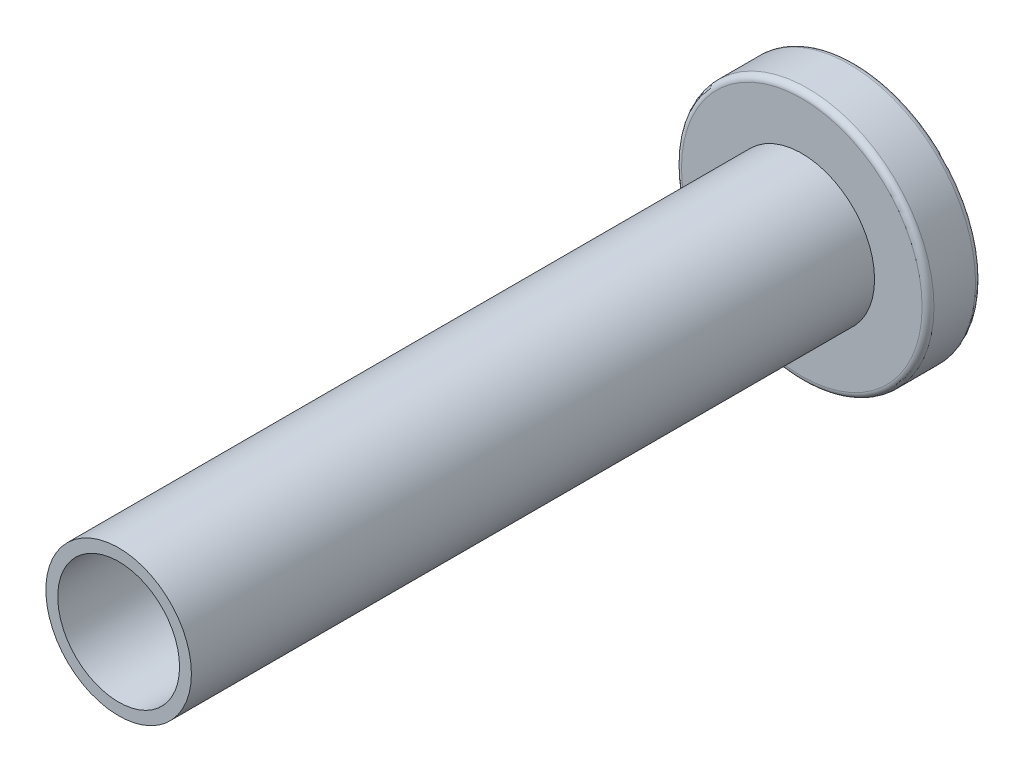
ISO-10303-21;
HEADER;
FILE_DESCRIPTION(('STEP AP214'),'2;1');
FILE_NAME('part.step','',(''),(''),'','','');
FILE_SCHEMA(('AUTOMOTIVE_DESIGN { 1 0 10303 214 1 1 1 1 }'));
ENDSEC;
DATA;
#1=APPLICATION_CONTEXT('core data for automotive mechanical design processes');
#2=APPLICATION_PROTOCOL_DEFINITION('international standard','automotive_design',2000,#1);
#3=PRODUCT_CONTEXT('',#1,'mechanical');
#4=PRODUCT('Part','Part','',(#3));
#5=PRODUCT_RELATED_PRODUCT_CATEGORY('part','',(#4));
#6=PRODUCT_DEFINITION_FORMATION('','',#4);
#7=PRODUCT_DEFINITION_CONTEXT('part definition',#1,'design');
#8=PRODUCT_DEFINITION('design','',#6,#7);
#9=PRODUCT_DEFINITION_SHAPE('','',#8);
#10=(LENGTH_UNIT() NAMED_UNIT(*) SI_UNIT(.MILLI.,.METRE.));
#11=(NAMED_UNIT(*) PLANE_ANGLE_UNIT() SI_UNIT($,.RADIAN.));
#12=(NAMED_UNIT(*) SI_UNIT($,.STERADIAN.) SOLID_ANGLE_UNIT());
#13=UNCERTAINTY_MEASURE_WITH_UNIT(LENGTH_MEASURE(1.E-05),#10,'distance_accuracy_value','');
#14=(GEOMETRIC_REPRESENTATION_CONTEXT(3) GLOBAL_UNCERTAINTY_ASSIGNED_CONTEXT((#13)) GLOBAL_UNIT_ASSIGNED_CONTEXT((#10,
#11,#12)) REPRESENTATION_CONTEXT('',''));
#15=CARTESIAN_POINT('',(0.,0.,0.));
#16=DIRECTION('',(0.,0.,1.));
#17=DIRECTION('',(1.,0.,0.));
#18=AXIS2_PLACEMENT_3D('',#15,#16,#17);
#19=CARTESIAN_POINT('',(0.,0.,1.8));
#20=DIRECTION('',(0.,0.,-1.));
#21=DIRECTION('',(-1.,0.,0.));
#22=AXIS2_PLACEMENT_3D('',#19,#20,#21);
#23=CYLINDRICAL_SURFACE('',#22,4.25);
#24=CARTESIAN_POINT('',(0.,0.,0.2));
#25=DIRECTION('',(0.,0.,1.));
#26=DIRECTION('',(1.,0.,0.));
#27=AXIS2_PLACEMENT_3D('',#24,#25,#26);
#28=CIRCLE('',#27,4.25);
#29=CARTESIAN_POINT('',(4.25,0.,0.2));
#30=VERTEX_POINT('',#29);
#31=EDGE_CURVE('E160',#30,#30,#28,.T.);
#32=ORIENTED_EDGE('',*,*,#31,.T.);
#33=EDGE_LOOP('',(#32));
#34=FACE_BOUND('',#33,.T.);
#35=CARTESIAN_POINT('',(0.,0.,1.6));
#36=DIRECTION('',(0.,0.,1.));
#37=DIRECTION('',(1.,0.,0.));
#38=AXIS2_PLACEMENT_3D('',#35,#36,#37);
#39=CIRCLE('',#38,4.25);
#40=CARTESIAN_POINT('',(4.25,0.,1.6));
#41=VERTEX_POINT('',#40);
#42=EDGE_CURVE('E157',#41,#41,#39,.F.);
#43=ORIENTED_EDGE('',*,*,#42,.T.);
#44=EDGE_LOOP('',(#43));
#45=FACE_BOUND('',#44,.T.);
#46=ADVANCED_FACE('F38',(#34,#45),#23,.T.);
#47=CARTESIAN_POINT('',(0.,0.,1.8));
#48=DIRECTION('',(0.,0.,1.));
#49=DIRECTION('',(1.,0.,0.));
#50=AXIS2_PLACEMENT_3D('',#47,#48,#49);
#51=PLANE('',#50);
#52=CARTESIAN_POINT('',(0.,0.,1.8));
#53=DIRECTION('',(0.,0.,1.));
#54=DIRECTION('',(1.,0.,0.));
#55=AXIS2_PLACEMENT_3D('',#52,#53,#54);
#56=CIRCLE('',#55,4.05);
#57=CARTESIAN_POINT('',(4.05,0.,1.8));
#58=VERTEX_POINT('',#57);
#59=EDGE_CURVE('E11',#58,#58,#56,.T.);
#60=ORIENTED_EDGE('',*,*,#59,.T.);
#61=EDGE_LOOP('',(#60));
#62=FACE_BOUND('',#61,.T.);
#63=CARTESIAN_POINT('',(0.,0.,1.8));
#64=DIRECTION('',(0.,0.,1.));
#65=DIRECTION('',(1.,0.,0.));
#66=AXIS2_PLACEMENT_3D('',#63,#64,#65);
#67=CIRCLE('',#66,2.45);
#68=CARTESIAN_POINT('',(2.45,0.,1.8));
#69=VERTEX_POINT('',#68);
#70=EDGE_CURVE('E148',#69,#69,#67,.T.);
#71=ORIENTED_EDGE('',*,*,#70,.F.);
#72=EDGE_LOOP('',(#71));
#73=FACE_BOUND('',#72,.T.);
#74=ADVANCED_FACE('F175',(#62,#73),#51,.T.);
#75=CARTESIAN_POINT('',(0.,0.,0.));
#76=DIRECTION('',(0.,0.,1.));
#77=DIRECTION('',(1.,0.,0.));
#78=AXIS2_PLACEMENT_3D('',#75,#76,#77);
#79=PLANE('',#78);
#80=DIRECTION('',(0.5,0.866025403784438,0.));
#81=VECTOR('',#80,1.);
#82=CARTESIAN_POINT('',(-1.44337567297407,0.,0.));
#83=LINE('',#82,#81);
#84=CARTESIAN_POINT('',(-1.44337567297407,0.,0.));
#85=VERTEX_POINT('',#84);
#86=CARTESIAN_POINT('',(-0.721687836487032,1.25,0.));
#87=VERTEX_POINT('',#86);
#88=EDGE_CURVE('E127',#85,#87,#83,.T.);
#89=ORIENTED_EDGE('',*,*,#88,.F.);
#90=DIRECTION('',(-0.5,0.866025403784438,0.));
#91=VECTOR('',#90,1.);
#92=CARTESIAN_POINT('',(-0.721687836487033,-1.25,0.));
#93=LINE('',#92,#91);
#94=CARTESIAN_POINT('',(-0.721687836487033,-1.25,0.));
#95=VERTEX_POINT('',#94);
#96=EDGE_CURVE('E53',#95,#85,#93,.T.);
#97=ORIENTED_EDGE('',*,*,#96,.F.);
#98=DIRECTION('',(-1.,0.,0.));
#99=VECTOR('',#98,1.);
#100=CARTESIAN_POINT('',(0.721687836487032,-1.25,0.));
#101=LINE('',#100,#99);
#102=CARTESIAN_POINT('',(0.721687836487032,-1.25,0.));
#103=VERTEX_POINT('',#102);
#104=EDGE_CURVE('E136',#103,#95,#101,.T.);
#105=ORIENTED_EDGE('',*,*,#104,.F.);
#106=DIRECTION('',(-0.5,-0.866025403784438,0.));
#107=VECTOR('',#106,1.);
#108=CARTESIAN_POINT('',(1.44337567297406,0.,0.));
#109=LINE('',#108,#107);
#110=CARTESIAN_POINT('',(1.44337567297406,0.,0.));
#111=VERTEX_POINT('',#110);
#112=EDGE_CURVE('E134',#111,#103,#109,.T.);
#113=ORIENTED_EDGE('',*,*,#112,.F.);
#114=DIRECTION('',(0.5,-0.866025403784438,0.));
#115=VECTOR('',#114,1.);
#116=CARTESIAN_POINT('',(0.721687836487032,1.25,0.));
#117=LINE('',#116,#115);
#118=CARTESIAN_POINT('',(0.721687836487032,1.25,0.));
#119=VERTEX_POINT('',#118);
#120=EDGE_CURVE('E101',#119,#111,#117,.T.);
#121=ORIENTED_EDGE('',*,*,#120,.F.);
#122=DIRECTION('',(1.,0.,0.));
#123=VECTOR('',#122,1.);
#124=CARTESIAN_POINT('',(-0.721687836487032,1.25,0.));
#125=LINE('',#124,#123);
#126=EDGE_CURVE('E130',#87,#119,#125,.T.);
#127=ORIENTED_EDGE('',*,*,#126,.F.);
#128=EDGE_LOOP('',(#89,#97,#105,#113,#121,#127));
#129=FACE_BOUND('',#128,.T.);
#130=CARTESIAN_POINT('',(0.,0.,0.));
#131=DIRECTION('',(0.,0.,1.));
#132=DIRECTION('',(1.,0.,0.));
#133=AXIS2_PLACEMENT_3D('',#130,#131,#132);
#134=CIRCLE('',#133,4.05);
#135=CARTESIAN_POINT('',(4.05,0.,0.));
#136=VERTEX_POINT('',#135);
#137=EDGE_CURVE('E46',#136,#136,#134,.F.);
#138=ORIENTED_EDGE('',*,*,#137,.T.);
#139=EDGE_LOOP('',(#138));
#140=FACE_BOUND('',#139,.T.);
#141=ADVANCED_FACE('F165',(#129,#140),#79,.F.);
#142=CARTESIAN_POINT('',(0.,0.,24.8));
#143=DIRECTION('',(0.,0.,1.));
#144=DIRECTION('',(1.,0.,0.));
#145=AXIS2_PLACEMENT_3D('',#142,#143,#144);
#146=PLANE('',#145);
#147=CARTESIAN_POINT('',(0.,0.,24.8));
#148=DIRECTION('',(0.,0.,1.));
#149=DIRECTION('',(1.,0.,0.));
#150=AXIS2_PLACEMENT_3D('',#147,#148,#149);
#151=CIRCLE('',#150,2.45);
#152=CARTESIAN_POINT('',(2.45,0.,24.8));
#153=VERTEX_POINT('',#152);
#154=EDGE_CURVE('E149',#153,#153,#151,.T.);
#155=ORIENTED_EDGE('',*,*,#154,.T.);
#156=EDGE_LOOP('',(#155));
#157=FACE_BOUND('',#156,.T.);
#158=CARTESIAN_POINT('',(0.,0.,24.8));
#159=DIRECTION('',(0.,0.,1.));
#160=DIRECTION('',(1.,0.,0.));
#161=AXIS2_PLACEMENT_3D('',#158,#159,#160);
#162=CIRCLE('',#161,2.05);
#163=CARTESIAN_POINT('',(2.05,0.,24.8));
#164=VERTEX_POINT('',#163);
#165=EDGE_CURVE('E140',#164,#164,#162,.T.);
#166=ORIENTED_EDGE('',*,*,#165,.F.);
#167=EDGE_LOOP('',(#166));
#168=FACE_BOUND('',#167,.T.);
#169=ADVANCED_FACE('F192',(#157,#168),#146,.T.);
#170=CARTESIAN_POINT('',(0.,0.,24.8));
#171=DIRECTION('',(0.,0.,-1.));
#172=DIRECTION('',(-1.,0.,0.));
#173=AXIS2_PLACEMENT_3D('',#170,#171,#172);
#174=CYLINDRICAL_SURFACE('',#173,2.45);
#175=ORIENTED_EDGE('',*,*,#154,.F.);
#176=EDGE_LOOP('',(#175));
#177=FACE_BOUND('',#176,.T.);
#178=ORIENTED_EDGE('',*,*,#70,.T.);
#179=EDGE_LOOP('',(#178));
#180=FACE_BOUND('',#179,.T.);
#181=ADVANCED_FACE('F189',(#177,#180),#174,.T.);
#182=CARTESIAN_POINT('',(0.,0.,24.8));
#183=DIRECTION('',(0.,0.,-1.));
#184=DIRECTION('',(-1.,0.,0.));
#185=AXIS2_PLACEMENT_3D('',#182,#183,#184);
#186=CYLINDRICAL_SURFACE('',#185,2.05);
#187=ORIENTED_EDGE('',*,*,#165,.T.);
#188=EDGE_LOOP('',(#187));
#189=FACE_BOUND('',#188,.T.);
#190=CARTESIAN_POINT('',(0.,0.,1.8));
#191=DIRECTION('',(0.,0.,1.));
#192=DIRECTION('',(1.,0.,0.));
#193=AXIS2_PLACEMENT_3D('',#190,#191,#192);
#194=CIRCLE('',#193,2.05);
#195=CARTESIAN_POINT('',(2.05,0.,1.8));
#196=VERTEX_POINT('',#195);
#197=EDGE_CURVE('E152',#196,#196,#194,.F.);
#198=ORIENTED_EDGE('',*,*,#197,.T.);
#199=EDGE_LOOP('',(#198));
#200=FACE_BOUND('',#199,.T.);
#201=ADVANCED_FACE('F191',(#189,#200),#186,.F.);
#202=ORIENTED_EDGE('',*,*,#197,.F.);
#203=EDGE_LOOP('',(#202));
#204=FACE_BOUND('',#203,.T.);
#205=ADVANCED_FACE('F170',(#204),#51,.T.);
#206=CARTESIAN_POINT('',(0.,0.,0.2));
#207=DIRECTION('',(0.,0.,1.));
#208=DIRECTION('',(1.,0.,0.));
#209=AXIS2_PLACEMENT_3D('',#206,#207,#208);
#210=TOROIDAL_SURFACE('',#209,4.05,0.2);
#211=ORIENTED_EDGE('',*,*,#137,.F.);
#212=EDGE_LOOP('',(#211));
#213=FACE_BOUND('',#212,.T.);
#214=ORIENTED_EDGE('',*,*,#31,.F.);
#215=EDGE_LOOP('',(#214));
#216=FACE_BOUND('',#215,.T.);
#217=ADVANCED_FACE('F167',(#213,#216),#210,.T.);
#218=CARTESIAN_POINT('',(0.,0.,1.6));
#219=DIRECTION('',(0.,0.,1.));
#220=DIRECTION('',(1.,0.,0.));
#221=AXIS2_PLACEMENT_3D('',#218,#219,#220);
#222=TOROIDAL_SURFACE('',#221,4.05,0.2);
#223=ORIENTED_EDGE('',*,*,#42,.F.);
#224=EDGE_LOOP('',(#223));
#225=FACE_BOUND('',#224,.T.);
#226=ORIENTED_EDGE('',*,*,#59,.F.);
#227=EDGE_LOOP('',(#226));
#228=FACE_BOUND('',#227,.T.);
#229=ADVANCED_FACE('F40',(#225,#228),#222,.T.);
#230=CARTESIAN_POINT('',(-0.721687836487033,-1.25,1.));
#231=DIRECTION('',(-0.866025403784439,-0.5,0.));
#232=DIRECTION('',(0.5,-0.866025403784439,0.));
#233=AXIS2_PLACEMENT_3D('',#230,#231,#232);
#234=PLANE('',#233);
#235=ORIENTED_EDGE('',*,*,#96,.T.);
#236=DIRECTION('',(0.,0.,-1.));
#237=VECTOR('',#236,1.);
#238=CARTESIAN_POINT('',(-1.44337567297407,0.,1.));
#239=LINE('',#238,#237);
#240=CARTESIAN_POINT('',(-1.44337567297407,0.,1.));
#241=VERTEX_POINT('',#240);
#242=EDGE_CURVE('E83',#241,#85,#239,.T.);
#243=ORIENTED_EDGE('',*,*,#242,.F.);
#244=DIRECTION('',(-0.5,0.866025403784438,0.));
#245=VECTOR('',#244,1.);
#246=CARTESIAN_POINT('',(-0.721687836487033,-1.25,1.));
#247=LINE('',#246,#245);
#248=CARTESIAN_POINT('',(-0.721687836487033,-1.25,1.));
#249=VERTEX_POINT('',#248);
#250=EDGE_CURVE('E138',#249,#241,#247,.T.);
#251=ORIENTED_EDGE('',*,*,#250,.F.);
#252=DIRECTION('',(0.,0.,-1.));
#253=VECTOR('',#252,1.);
#254=CARTESIAN_POINT('',(-0.721687836487033,-1.25,1.));
#255=LINE('',#254,#253);
#256=EDGE_CURVE('E61',#249,#95,#255,.T.);
#257=ORIENTED_EDGE('',*,*,#256,.T.);
#258=EDGE_LOOP('',(#235,#243,#251,#257));
#259=FACE_BOUND('',#258,.T.);
#260=ADVANCED_FACE('F181',(#259),#234,.F.);
#261=CARTESIAN_POINT('',(0.721687836487032,-1.25,1.));
#262=DIRECTION('',(0.,-1.,0.));
#263=DIRECTION('',(1.,0.,0.));
#264=AXIS2_PLACEMENT_3D('',#261,#262,#263);
#265=PLANE('',#264);
#266=ORIENTED_EDGE('',*,*,#104,.T.);
#267=ORIENTED_EDGE('',*,*,#256,.F.);
#268=DIRECTION('',(-1.,0.,0.));
#269=VECTOR('',#268,1.);
#270=CARTESIAN_POINT('',(0.721687836487032,-1.25,1.));
#271=LINE('',#270,#269);
#272=CARTESIAN_POINT('',(0.721687836487032,-1.25,1.));
#273=VERTEX_POINT('',#272);
#274=EDGE_CURVE('E113',#273,#249,#271,.T.);
#275=ORIENTED_EDGE('',*,*,#274,.F.);
#276=DIRECTION('',(0.,0.,-1.));
#277=VECTOR('',#276,1.);
#278=CARTESIAN_POINT('',(0.721687836487032,-1.25,1.));
#279=LINE('',#278,#277);
#280=EDGE_CURVE('E105',#273,#103,#279,.T.);
#281=ORIENTED_EDGE('',*,*,#280,.T.);
#282=EDGE_LOOP('',(#266,#267,#275,#281));
#283=FACE_BOUND('',#282,.T.);
#284=ADVANCED_FACE('F216',(#283),#265,.F.);
#285=CARTESIAN_POINT('',(1.44337567297406,0.,1.));
#286=DIRECTION('',(0.866025403784438,-0.5,0.));
#287=DIRECTION('',(0.5,0.866025403784439,0.));
#288=AXIS2_PLACEMENT_3D('',#285,#286,#287);
#289=PLANE('',#288);
#290=ORIENTED_EDGE('',*,*,#112,.T.);
#291=ORIENTED_EDGE('',*,*,#280,.F.);
#292=DIRECTION('',(-0.5,-0.866025403784438,0.));
#293=VECTOR('',#292,1.);
#294=CARTESIAN_POINT('',(1.44337567297406,0.,1.));
#295=LINE('',#294,#293);
#296=CARTESIAN_POINT('',(1.44337567297406,0.,1.));
#297=VERTEX_POINT('',#296);
#298=EDGE_CURVE('E109',#297,#273,#295,.T.);
#299=ORIENTED_EDGE('',*,*,#298,.F.);
#300=DIRECTION('',(0.,0.,-1.));
#301=VECTOR('',#300,1.);
#302=CARTESIAN_POINT('',(1.44337567297406,0.,1.));
#303=LINE('',#302,#301);
#304=EDGE_CURVE('E94',#297,#111,#303,.T.);
#305=ORIENTED_EDGE('',*,*,#304,.T.);
#306=EDGE_LOOP('',(#290,#291,#299,#305));
#307=FACE_BOUND('',#306,.T.);
#308=ADVANCED_FACE('F110',(#307),#289,.F.);
#309=CARTESIAN_POINT('',(0.721687836487032,1.25,1.));
#310=DIRECTION('',(0.866025403784439,0.5,0.));
#311=DIRECTION('',(-0.5,0.866025403784438,0.));
#312=AXIS2_PLACEMENT_3D('',#309,#310,#311);
#313=PLANE('',#312);
#314=ORIENTED_EDGE('',*,*,#120,.T.);
#315=ORIENTED_EDGE('',*,*,#304,.F.);
#316=DIRECTION('',(0.5,-0.866025403784438,0.));
#317=VECTOR('',#316,1.);
#318=CARTESIAN_POINT('',(0.721687836487032,1.25,1.));
#319=LINE('',#318,#317);
#320=CARTESIAN_POINT('',(0.721687836487032,1.25,1.));
#321=VERTEX_POINT('',#320);
#322=EDGE_CURVE('E98',#321,#297,#319,.T.);
#323=ORIENTED_EDGE('',*,*,#322,.F.);
#324=DIRECTION('',(0.,0.,-1.));
#325=VECTOR('',#324,1.);
#326=CARTESIAN_POINT('',(0.721687836487032,1.25,1.));
#327=LINE('',#326,#325);
#328=EDGE_CURVE('E106',#321,#119,#327,.T.);
#329=ORIENTED_EDGE('',*,*,#328,.T.);
#330=EDGE_LOOP('',(#314,#315,#323,#329));
#331=FACE_BOUND('',#330,.T.);
#332=ADVANCED_FACE('F96',(#331),#313,.F.);
#333=CARTESIAN_POINT('',(-0.721687836487032,1.25,1.));
#334=DIRECTION('',(0.,1.,0.));
#335=DIRECTION('',(0.,0.,1.));
#336=AXIS2_PLACEMENT_3D('',#333,#334,#335);
#337=PLANE('',#336);
#338=ORIENTED_EDGE('',*,*,#126,.T.);
#339=ORIENTED_EDGE('',*,*,#328,.F.);
#340=DIRECTION('',(1.,0.,0.));
#341=VECTOR('',#340,1.);
#342=CARTESIAN_POINT('',(-0.721687836487032,1.25,1.));
#343=LINE('',#342,#341);
#344=CARTESIAN_POINT('',(-0.721687836487032,1.25,1.));
#345=VERTEX_POINT('',#344);
#346=EDGE_CURVE('E119',#345,#321,#343,.T.);
#347=ORIENTED_EDGE('',*,*,#346,.F.);
#348=DIRECTION('',(0.,0.,-1.));
#349=VECTOR('',#348,1.);
#350=CARTESIAN_POINT('',(-0.721687836487032,1.25,1.));
#351=LINE('',#350,#349);
#352=EDGE_CURVE('E143',#345,#87,#351,.T.);
#353=ORIENTED_EDGE('',*,*,#352,.T.);
#354=EDGE_LOOP('',(#338,#339,#347,#353));
#355=FACE_BOUND('',#354,.T.);
#356=ADVANCED_FACE('F225',(#355),#337,.F.);
#357=CARTESIAN_POINT('',(-1.44337567297407,0.,1.));
#358=DIRECTION('',(-0.866025403784439,0.5,0.));
#359=DIRECTION('',(-0.5,-0.866025403784438,0.));
#360=AXIS2_PLACEMENT_3D('',#357,#358,#359);
#361=PLANE('',#360);
#362=ORIENTED_EDGE('',*,*,#88,.T.);
#363=ORIENTED_EDGE('',*,*,#352,.F.);
#364=DIRECTION('',(0.5,0.866025403784438,0.));
#365=VECTOR('',#364,1.);
#366=CARTESIAN_POINT('',(-1.44337567297407,0.,1.));
#367=LINE('',#366,#365);
#368=EDGE_CURVE('E121',#241,#345,#367,.T.);
#369=ORIENTED_EDGE('',*,*,#368,.F.);
#370=ORIENTED_EDGE('',*,*,#242,.T.);
#371=EDGE_LOOP('',(#362,#363,#369,#370));
#372=FACE_BOUND('',#371,.T.);
#373=ADVANCED_FACE('F213',(#372),#361,.F.);
#374=CARTESIAN_POINT('',(0.,0.,1.));
#375=DIRECTION('',(0.,0.,-1.));
#376=DIRECTION('',(-1.,0.,0.));
#377=AXIS2_PLACEMENT_3D('',#374,#375,#376);
#378=PLANE('',#377);
#379=ORIENTED_EDGE('',*,*,#250,.T.);
#380=ORIENTED_EDGE('',*,*,#368,.T.);
#381=ORIENTED_EDGE('',*,*,#346,.T.);
#382=ORIENTED_EDGE('',*,*,#322,.T.);
#383=ORIENTED_EDGE('',*,*,#298,.T.);
#384=ORIENTED_EDGE('',*,*,#274,.T.);
#385=EDGE_LOOP('',(#379,#380,#381,#382,#383,#384));
#386=FACE_BOUND('',#385,.T.);
#387=ADVANCED_FACE('F116',(#386),#378,.T.);
#388=CLOSED_SHELL('',(#46,#74,#141,#169,#181,#201,#205,#217,#229,#260,#284,#308,#332,#356,#373,#387));
#389=MANIFOLD_SOLID_BREP('B2',#388);
#390=ADVANCED_BREP_SHAPE_REPRESENTATION('',(#18,#389),#14);
#391=SHAPE_DEFINITION_REPRESENTATION(#9,#390);
ENDSEC;
END-ISO-10303-21;
